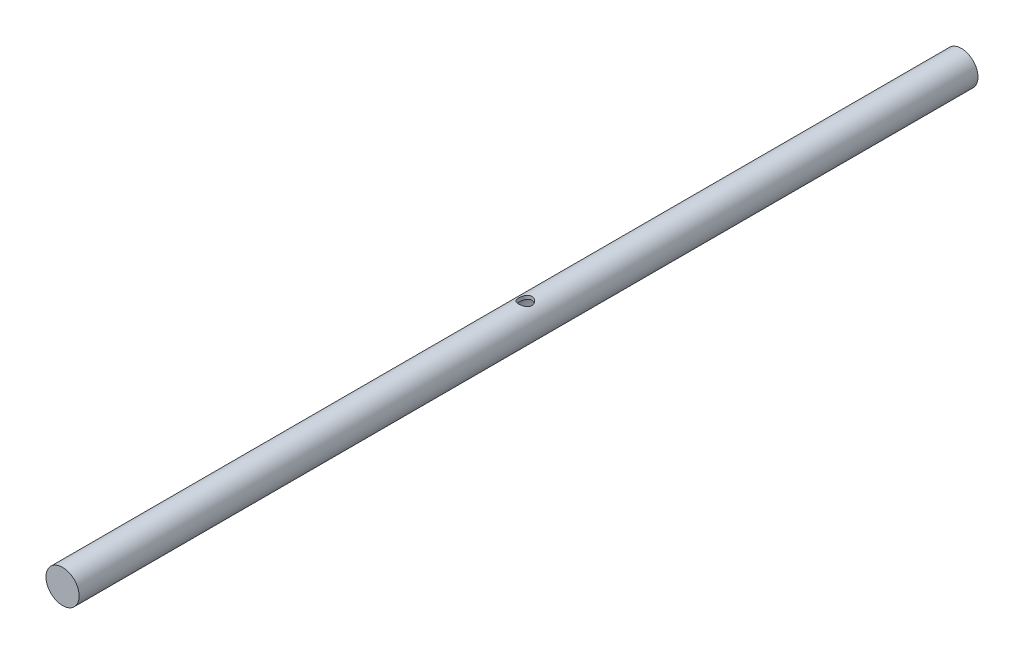
ISO-10303-21;
HEADER;
FILE_DESCRIPTION(('STEP AP214'),'2;1');
FILE_NAME('part.step','',(''),(''),'','','');
FILE_SCHEMA(('AUTOMOTIVE_DESIGN { 1 0 10303 214 1 1 1 1 }'));
ENDSEC;
DATA;
#1=APPLICATION_CONTEXT('core data for automotive mechanical design processes');
#2=APPLICATION_PROTOCOL_DEFINITION('international standard','automotive_design',2000,#1);
#3=PRODUCT_CONTEXT('',#1,'mechanical');
#4=PRODUCT('Part','Part','',(#3));
#5=PRODUCT_RELATED_PRODUCT_CATEGORY('part','',(#4));
#6=PRODUCT_DEFINITION_FORMATION('','',#4);
#7=PRODUCT_DEFINITION_CONTEXT('part definition',#1,'design');
#8=PRODUCT_DEFINITION('design','',#6,#7);
#9=PRODUCT_DEFINITION_SHAPE('','',#8);
#10=(LENGTH_UNIT() NAMED_UNIT(*) SI_UNIT(.MILLI.,.METRE.));
#11=(NAMED_UNIT(*) PLANE_ANGLE_UNIT() SI_UNIT($,.RADIAN.));
#12=(NAMED_UNIT(*) SI_UNIT($,.STERADIAN.) SOLID_ANGLE_UNIT());
#13=UNCERTAINTY_MEASURE_WITH_UNIT(LENGTH_MEASURE(1.E-05),#10,'distance_accuracy_value','');
#14=(GEOMETRIC_REPRESENTATION_CONTEXT(3) GLOBAL_UNCERTAINTY_ASSIGNED_CONTEXT((#13)) GLOBAL_UNIT_ASSIGNED_CONTEXT((#10,
#11,#12)) REPRESENTATION_CONTEXT('',''));
#15=CARTESIAN_POINT('',(0.,0.,0.));
#16=DIRECTION('',(0.,0.,1.));
#17=DIRECTION('',(1.,0.,0.));
#18=AXIS2_PLACEMENT_3D('',#15,#16,#17);
#19=CARTESIAN_POINT('',(0.,0.,172.085));
#20=DIRECTION('',(0.,0.,-1.));
#21=DIRECTION('',(-1.,0.,0.));
#22=AXIS2_PLACEMENT_3D('',#19,#20,#21);
#23=CYLINDRICAL_SURFACE('',#22,3.175);
#24=CARTESIAN_POINT('',(0.,0.,172.085));
#25=DIRECTION('',(0.,0.,1.));
#26=DIRECTION('',(1.,0.,0.));
#27=AXIS2_PLACEMENT_3D('',#24,#25,#26);
#28=CIRCLE('',#27,3.175);
#29=CARTESIAN_POINT('',(3.175,0.,172.085));
#30=VERTEX_POINT('',#29);
#31=EDGE_CURVE('E10',#30,#30,#28,.T.);
#32=ORIENTED_EDGE('',*,*,#31,.F.);
#33=EDGE_LOOP('',(#32));
#34=FACE_BOUND('',#33,.T.);
#35=CARTESIAN_POINT('',(0.,0.,0.));
#36=DIRECTION('',(0.,0.,1.));
#37=DIRECTION('',(1.,0.,0.));
#38=AXIS2_PLACEMENT_3D('',#35,#36,#37);
#39=CIRCLE('',#38,3.175);
#40=CARTESIAN_POINT('',(3.175,0.,0.));
#41=VERTEX_POINT('',#40);
#42=EDGE_CURVE('E43',#41,#41,#39,.T.);
#43=ORIENTED_EDGE('',*,*,#42,.T.);
#44=EDGE_LOOP('',(#43));
#45=FACE_BOUND('',#44,.T.);
#46=CARTESIAN_POINT('',(0.,3.175,82.2325));
#47=CARTESIAN_POINT('',(-0.068258058456236,3.17499537229199,82.2325062559081));
#48=CARTESIAN_POINT('',(-0.136634578197577,3.17277301884902,82.2380357725761));
#49=CARTESIAN_POINT('',(-0.271460265065364,3.16409992718907,82.259962291736));
#50=CARTESIAN_POINT('',(-0.337903678751393,3.15763769473787,82.2763888372197));
#51=CARTESIAN_POINT('',(-0.466695740931902,3.1411812285033,82.3194163095674));
#52=CARTESIAN_POINT('',(-0.529057020126769,3.13119856591186,82.3459839273476));
#53=CARTESIAN_POINT('',(-0.648380701158513,3.1086844785551,82.4084071750624));
#54=CARTESIAN_POINT('',(-0.705344967736879,3.09615393885866,82.4442595808735));
#55=CARTESIAN_POINT('',(-0.815023139807199,3.06915112718216,82.5260195415862));
#56=CARTESIAN_POINT('',(-0.867449543069387,3.05461858550036,82.5722927267126));
#57=CARTESIAN_POINT('',(-0.964041128038302,3.02552466335433,82.6728090022077));
#58=CARTESIAN_POINT('',(-1.0082022680298,3.01096327228158,82.7270559687294));
#59=CARTESIAN_POINT('',(-1.08894535023098,2.98273972791181,82.8449118246039));
#60=CARTESIAN_POINT('',(-1.12510251305913,2.96914643637744,82.9088299186247));
#61=CARTESIAN_POINT('',(-1.18602424658859,2.94534365963613,83.0424656129967));
#62=CARTESIAN_POINT('',(-1.21079422832151,2.93513256790051,83.1121804401837));
#63=CARTESIAN_POINT('',(-1.24707575285638,2.9198973711462,83.252127331831));
#64=CARTESIAN_POINT('',(-1.25913766828659,2.91465901925809,83.3221925345909));
#65=CARTESIAN_POINT('',(-1.27137983064142,2.90934142571206,83.4635332239251));
#66=CARTESIAN_POINT('',(-1.2715659203589,2.90925964706958,83.5348080980869));
#67=CARTESIAN_POINT('',(-1.26046824836539,2.91408167677796,83.6712554863759));
#68=CARTESIAN_POINT('',(-1.24998182458377,2.91863891149416,83.7365074786498));
#69=CARTESIAN_POINT('',(-1.21916626898912,2.93164379130976,83.8642338180643));
#70=CARTESIAN_POINT('',(-1.19883541970094,2.94009211524262,83.9267076784501));
#71=CARTESIAN_POINT('',(-1.14852115516993,2.96011273031217,84.0486113259845));
#72=CARTESIAN_POINT('',(-1.11834921257023,2.971745258433,84.1079529667997));
#73=CARTESIAN_POINT('',(-1.04934160256496,2.9968070390758,84.2209490433896));
#74=CARTESIAN_POINT('',(-1.01050268123904,3.01023696565099,84.2746013319708));
#75=CARTESIAN_POINT('',(-0.921734630653569,3.03864477831342,84.3790601777893));
#76=CARTESIAN_POINT('',(-0.87118028898635,3.05366207259856,84.4293261431982));
#77=CARTESIAN_POINT('',(-0.762199661418166,3.08266988848509,84.5208396435313));
#78=CARTESIAN_POINT('',(-0.703771811487362,3.09666020522781,84.5620853823556));
#79=CARTESIAN_POINT('',(-0.579169309404708,3.12238822602988,84.6350970791091));
#80=CARTESIAN_POINT('',(-0.51286441200501,3.13407596510588,84.6666596485601));
#81=CARTESIAN_POINT('',(-0.375300091081626,3.15350415988762,84.7179965917846));
#82=CARTESIAN_POINT('',(-0.304043204999539,3.16124662048613,84.737776953849));
#83=CARTESIAN_POINT('',(-0.163128888630963,3.17154648586888,84.7638946675915));
#84=CARTESIAN_POINT('',(-0.093626491680812,3.17438370604281,84.770958508451));
#85=CARTESIAN_POINT('',(0.0456217717279651,3.17543483854251,84.7735878188357));
#86=CARTESIAN_POINT('',(0.115367570397192,3.17364994924755,84.7691562687827));
#87=CARTESIAN_POINT('',(0.249829789342462,3.16584055085483,84.7494547371295));
#88=CARTESIAN_POINT('',(0.314631382277427,3.16001013504407,84.7346806824771));
#89=CARTESIAN_POINT('',(0.440775996818596,3.14489745292492,84.6953883252233));
#90=CARTESIAN_POINT('',(0.502118572992776,3.13561474321397,84.6708687709104));
#91=CARTESIAN_POINT('',(0.621715028993605,3.11414537679465,84.6119815633032));
#92=CARTESIAN_POINT('',(0.679817044449683,3.10187858147175,84.5773356252526));
#93=CARTESIAN_POINT('',(0.789586680441565,3.07577086613408,84.4994878943199));
#94=CARTESIAN_POINT('',(0.841251708883318,3.06192931625022,84.4562826727442));
#95=CARTESIAN_POINT('',(0.940259132323303,3.03304649700201,84.359197541777));
#96=CARTESIAN_POINT('',(0.987090947966854,3.01798635304908,84.3048012011436));
#97=CARTESIAN_POINT('',(1.07108701035771,2.98920962302379,84.1886555472891));
#98=CARTESIAN_POINT('',(1.10824966394932,2.97549325859334,84.1269050247842));
#99=CARTESIAN_POINT('',(1.17208776372659,2.95093580441395,83.9968718239328));
#100=CARTESIAN_POINT('',(1.19865812752938,2.9401238561184,83.9285316605002));
#101=CARTESIAN_POINT('',(1.23970809951287,2.92305532658486,83.7877841311609));
#102=CARTESIAN_POINT('',(1.25419663134602,2.91679538366959,83.7153798093091));
#103=CARTESIAN_POINT('',(1.26981941697179,2.91002567155453,83.5741737823732));
#104=CARTESIAN_POINT('',(1.27183964726232,2.90913452340189,83.5054877768582));
#105=CARTESIAN_POINT('',(1.26479500614123,2.91220420881017,83.3688040153521));
#106=CARTESIAN_POINT('',(1.25573154232526,2.91616442626244,83.3008061730719));
#107=CARTESIAN_POINT('',(1.22750031750757,2.92815422165178,83.1701840594421));
#108=CARTESIAN_POINT('',(1.20874630841757,2.9360166821043,83.107453625735));
#109=CARTESIAN_POINT('',(1.16205345979179,2.95480740782762,82.9860045701954));
#110=CARTESIAN_POINT('',(1.13411208368507,2.96573651965814,82.9272870617186));
#111=CARTESIAN_POINT('',(1.06798920435243,2.99020617098852,82.811867891763));
#112=CARTESIAN_POINT('',(1.02931298782628,3.00386040268909,82.7554741444671));
#113=CARTESIAN_POINT('',(0.943541495737399,3.03189515776371,82.6496992435756));
#114=CARTESIAN_POINT('',(0.896443682609507,3.04627589910738,82.6003202116985));
#115=CARTESIAN_POINT('',(0.791530996483016,3.07526415100495,82.5066911881776));
#116=CARTESIAN_POINT('',(0.733219260727802,3.08982591305988,82.4629813101197));
#117=CARTESIAN_POINT('',(0.609536703381478,3.1165825826321,82.3859559779353));
#118=CARTESIAN_POINT('',(0.544162617887505,3.12877638843995,82.3526453577832));
#119=CARTESIAN_POINT('',(0.409408669684464,3.14921718908072,82.2981448933542));
#120=CARTESIAN_POINT('',(0.340126077569516,3.15753345539943,82.2767408795392));
#121=CARTESIAN_POINT('',(0.198676606888582,3.16956634442947,82.246064158194));
#122=CARTESIAN_POINT('',(0.126519638920414,3.1732975617973,82.2367529526676));
#123=CARTESIAN_POINT('',(0.0361393091607427,3.17484696185127,82.2328839330788));
#124=CARTESIAN_POINT('',(0.0180738073503828,3.17500122535427,82.2324983435205));
#125=CARTESIAN_POINT('',(0.,3.175,82.2325));
#126=B_SPLINE_CURVE_WITH_KNOTS('',3,(#46,#47,#48,#49,#50,#51,#52,#53,#54,#55,#56,#57,#58,#59,
#60,#61,#62,#63,#64,#65,#66,#67,#68,#69,#70,#71,#72,#73,#74,#75,#76,#77,#78,#79,#80,#81,#82,#83,
#84,#85,#86,#87,#88,#89,#90,#91,#92,#93,#94,#95,#96,#97,#98,#99,#100,#101,#102,#103,#104,#105,
#106,#107,#108,#109,#110,#111,#112,#113,#114,#115,#116,#117,#118,#119,#120,#121,#122,#123,#124,
#125),.UNSPECIFIED.,.T.,.F.,(4,2,2,2,2,2,2,2,2,2,2,2,2,2,2,2,2,2,2,2,2,2,2,2,2,2,2,2,2,2,2,2,2,
2,2,2,2,2,2,4),(0.,0.204725897312101,0.410009108865039,0.61462377549445,0.819167485156698,
1.03249337379752,1.24592330783352,1.46885189350204,1.69167443680101,1.90439106871108,
2.11700304526211,2.31481838534874,2.51266824907591,2.71455595199749,2.91651957930747,
3.13409551733465,3.35171473953232,3.57363339858384,3.79543917132259,4.00411432175286,
4.21273537417004,4.41198289283374,4.61125601111062,4.81662431007898,5.02207504281847,
5.24108981386504,5.46014064842782,5.68131353664428,5.9023229213017,6.10742792604398,
6.31250688577536,6.50947592278472,6.70649938736281,6.91480372216003,7.12317092856233,
7.34504768943988,7.5670274341174,7.7848733114346,8.0020239527676,8.05623259144468),.UNSPECIFIED.);
#127=CARTESIAN_POINT('',(0.,3.175,82.2325));
#128=VERTEX_POINT('',#127);
#129=EDGE_CURVE('E53',#128,#128,#126,.T.);
#130=ORIENTED_EDGE('',*,*,#129,.F.);
#131=EDGE_LOOP('',(#130));
#132=FACE_BOUND('',#131,.T.);
#133=ADVANCED_FACE('F31',(#34,#45,#132),#23,.T.);
#134=CARTESIAN_POINT('',(0.,0.,172.085));
#135=DIRECTION('',(0.,0.,-1.));
#136=DIRECTION('',(-1.,0.,0.));
#137=AXIS2_PLACEMENT_3D('',#134,#135,#136);
#138=CYLINDRICAL_SURFACE('',#137,2.54);
#139=CARTESIAN_POINT('',(0.,0.,0.));
#140=DIRECTION('',(0.,0.,1.));
#141=DIRECTION('',(1.,0.,0.));
#142=AXIS2_PLACEMENT_3D('',#139,#140,#141);
#143=CIRCLE('',#142,2.54);
#144=CARTESIAN_POINT('',(2.54,0.,0.));
#145=VERTEX_POINT('',#144);
#146=EDGE_CURVE('E50',#145,#145,#143,.T.);
#147=ORIENTED_EDGE('',*,*,#146,.F.);
#148=EDGE_LOOP('',(#147));
#149=FACE_BOUND('',#148,.T.);
#150=CARTESIAN_POINT('',(0.,0.,171.45));
#151=DIRECTION('',(0.,0.,1.));
#152=DIRECTION('',(1.,0.,0.));
#153=AXIS2_PLACEMENT_3D('',#150,#151,#152);
#154=CIRCLE('',#153,2.54);
#155=CARTESIAN_POINT('',(2.54,0.,171.45));
#156=VERTEX_POINT('',#155);
#157=EDGE_CURVE('E48',#156,#156,#154,.T.);
#158=ORIENTED_EDGE('',*,*,#157,.T.);
#159=EDGE_LOOP('',(#158));
#160=FACE_BOUND('',#159,.T.);
#161=CARTESIAN_POINT('',(0.,2.54,82.2325));
#162=CARTESIAN_POINT('',(-0.0667663929502925,2.53999636023272,82.2325041939458));
#163=CARTESIAN_POINT('',(-0.1336123816165,2.53733923594787,82.2377959928645));
#164=CARTESIAN_POINT('',(-0.265328698790899,2.52697178167493,82.258729158033));
#165=CARTESIAN_POINT('',(-0.33019503012615,2.51925185542809,82.274390179107));
#166=CARTESIAN_POINT('',(-0.455845601998328,2.49956674842206,82.3152961369433));
#167=CARTESIAN_POINT('',(-0.516644639732754,2.48761807755451,82.340503827995));
#168=CARTESIAN_POINT('',(-0.633060223344333,2.46057136175039,82.3995946891335));
#169=CARTESIAN_POINT('',(-0.68867717736736,2.44547356514583,82.433477175196));
#170=CARTESIAN_POINT('',(-0.796934928557637,2.41244447987732,82.5112869068463));
#171=CARTESIAN_POINT('',(-0.849192118125082,2.39439702891971,82.5556978286344));
#172=CARTESIAN_POINT('',(-0.945869894981064,2.35788162213365,82.6522622786437));
#173=CARTESIAN_POINT('',(-0.990284510545599,2.33941335785474,82.704421651751));
#174=CARTESIAN_POINT('',(-1.07347004057186,2.30249668020631,82.8198538538947));
#175=CARTESIAN_POINT('',(-1.11153617615058,2.28416087452067,82.8836748448993));
#176=CARTESIAN_POINT('',(-1.17623364815119,2.25153193040847,83.0178265167025));
#177=CARTESIAN_POINT('',(-1.20287315300725,2.23723590660877,83.0881525034779));
#178=CARTESIAN_POINT('',(-1.24222820157951,2.21561491138017,83.2290246838859));
#179=CARTESIAN_POINT('',(-1.25568183849217,2.20792384911316,83.2993056541256));
#180=CARTESIAN_POINT('',(-1.27054228150224,2.1994100023463,83.4415131239799));
#181=CARTESIAN_POINT('',(-1.27196099223381,2.19858043065976,83.5134379269064));
#182=CARTESIAN_POINT('',(-1.26325285470882,2.20358881426705,83.6476432508805));
#183=CARTESIAN_POINT('',(-1.25448639061177,2.20864129850757,83.7100485196533));
#184=CARTESIAN_POINT('',(-1.22801360830231,2.22346810491989,83.8323468249038));
#185=CARTESIAN_POINT('',(-1.21030444235003,2.23324393116355,83.8922390545377));
#186=CARTESIAN_POINT('',(-1.16612642109023,2.25663095044181,84.0095209983584));
#187=CARTESIAN_POINT('',(-1.13946313523732,2.27032617643278,84.066819926458));
#188=CARTESIAN_POINT('',(-1.07828294333837,2.30001323437382,84.1764055515893));
#189=CARTESIAN_POINT('',(-1.04376250964184,2.31600609670842,84.2286899822121));
#190=CARTESIAN_POINT('',(-0.962743889739248,2.35093710537173,84.3337419909839));
#191=CARTESIAN_POINT('',(-0.915281962129001,2.36999158000667,84.3857302294417));
#192=CARTESIAN_POINT('',(-0.812235585001559,2.40725481591517,84.4813339816104));
#193=CARTESIAN_POINT('',(-0.75664727584935,2.42546316987677,84.524945493883));
#194=CARTESIAN_POINT('',(-0.635655962406451,2.46001523849364,84.6044607895078));
#195=CARTESIAN_POINT('',(-0.569917061331257,2.47623309885749,84.6399126000061));
#196=CARTESIAN_POINT('',(-0.432392093670782,2.50390509023977,84.6989632268846));
#197=CARTESIAN_POINT('',(-0.36061088185691,2.51536300258312,84.7225714549693));
#198=CARTESIAN_POINT('',(-0.219413444409098,2.53141903851624,84.7553237627202));
#199=CARTESIAN_POINT('',(-0.150293743796378,2.53650671642666,84.7655038693984));
#200=CARTESIAN_POINT('',(-0.0111500919356839,2.54092727093059,84.7743602085408));
#201=CARTESIAN_POINT('',(0.0588734152347709,2.54026287376067,84.7730418907622));
#202=CARTESIAN_POINT('',(0.192065874422208,2.5335381416187,84.7595375057082));
#203=CARTESIAN_POINT('',(0.255345448223436,2.52790002024001,84.7482016834329));
#204=CARTESIAN_POINT('',(0.378976753223429,2.5123415756982,84.7163176486932));
#205=CARTESIAN_POINT('',(0.439328160827562,2.50242078044602,84.6957684206043));
#206=CARTESIAN_POINT('',(0.557388532731071,2.4788399929536,84.6455019476299));
#207=CARTESIAN_POINT('',(0.61497260419781,2.46508119847823,84.6155393663517));
#208=CARTESIAN_POINT('',(0.724485929357626,2.43514847382729,84.5475734297295));
#209=CARTESIAN_POINT('',(0.776412759814607,2.41897351568547,84.5095666490664));
#210=CARTESIAN_POINT('',(0.87854496539913,2.3838944109858,84.4222842598273));
#211=CARTESIAN_POINT('',(0.92808053883729,2.36487823757521,84.372268557064));
#212=CARTESIAN_POINT('',(1.01835752781381,2.32743237336921,84.264595057888));
#213=CARTESIAN_POINT('',(1.05909285982737,2.30900309574539,84.2069320191032));
#214=CARTESIAN_POINT('',(1.13246905141207,2.27395014127107,84.0820725591656));
#215=CARTESIAN_POINT('',(1.16462237976587,2.25745712672609,84.0145496919151));
#216=CARTESIAN_POINT('',(1.21676518903753,2.2297907190752,83.8739622140305));
#217=CARTESIAN_POINT('',(1.23677034317722,2.21861047565585,83.8009048813435));
#218=CARTESIAN_POINT('',(1.2622043430611,2.20423106281007,83.658824016966));
#219=CARTESIAN_POINT('',(1.2688481054291,2.20036876994824,83.5900864981451));
#220=CARTESIAN_POINT('',(1.2708752260636,2.19920000400642,83.4524022246932));
#221=CARTESIAN_POINT('',(1.26626346521299,2.20189068926992,83.3834555737009));
#222=CARTESIAN_POINT('',(1.24704617950218,2.21282084803531,83.2542359530543));
#223=CARTESIAN_POINT('',(1.23343455921536,2.2205072999264,83.1937624029166));
#224=CARTESIAN_POINT('',(1.19783270494531,2.23991190558655,83.0760236883306));
#225=CARTESIAN_POINT('',(1.17583977577296,2.25163135613488,83.0187595627432));
#226=CARTESIAN_POINT('',(1.12244599653187,2.2787423356295,82.904806439247));
#227=CARTESIAN_POINT('',(1.09051234502691,2.29432767443162,82.8484145646763));
#228=CARTESIAN_POINT('',(1.01873173397854,2.32708871175929,82.7414213390507));
#229=CARTESIAN_POINT('',(0.978880657473093,2.34426523519043,82.6908230222415));
#230=CARTESIAN_POINT('',(0.886718224864103,2.38077150412327,82.5904596824059));
#231=CARTESIAN_POINT('',(0.833481217222927,2.40010928805565,82.5415429400004));
#232=CARTESIAN_POINT('',(0.719016603899765,2.43684745363961,82.453146011052));
#233=CARTESIAN_POINT('',(0.657784718536125,2.45424678832211,82.4136709109286));
#234=CARTESIAN_POINT('',(0.528233127961338,2.48536472173081,82.345229819292));
#235=CARTESIAN_POINT('',(0.459866369996967,2.49905642634894,82.3163401048475));
#236=CARTESIAN_POINT('',(0.318442468643631,2.52096703531601,82.2708436267429));
#237=CARTESIAN_POINT('',(0.245399305521431,2.52920148683624,82.2542019545264));
#238=CARTESIAN_POINT('',(0.143004472033908,2.53613236625272,82.2402502879337));
#239=CARTESIAN_POINT('',(0.114505586888172,2.53757893980786,82.2373480461032));
#240=CARTESIAN_POINT('',(0.0573426993950949,2.53951355161888,82.2334719747936));
#241=CARTESIAN_POINT('',(0.0286786925121767,2.54000156341779,82.2324981985416));
#242=CARTESIAN_POINT('',(0.,2.54,82.2325));
#243=B_SPLINE_CURVE_WITH_KNOTS('',3,(#161,#162,#163,#164,#165,#166,#167,#168,#169,#170,#171,
#172,#173,#174,#175,#176,#177,#178,#179,#180,#181,#182,#183,#184,#185,#186,#187,#188,#189,#190,
#191,#192,#193,#194,#195,#196,#197,#198,#199,#200,#201,#202,#203,#204,#205,#206,#207,#208,#209,
#210,#211,#212,#213,#214,#215,#216,#217,#218,#219,#220,#221,#222,#223,#224,#225,#226,#227,#228,
#229,#230,#231,#232,#233,#234,#235,#236,#237,#238,#239,#240,#241,#242),.UNSPECIFIED.,.T.,.F.,(4,
2,2,2,2,2,2,2,2,2,2,2,2,2,2,2,2,2,2,2,2,2,2,2,2,2,2,2,2,2,2,2,2,2,2,2,2,2,2,2,4),(0.,
0.20018280692377,0.400746150130682,0.60053493747521,0.800307975938585,1.01216683357198,
1.22418632182064,1.45264792567057,1.68094593830819,1.89557675418092,2.10999523807855,
2.29877254759836,2.4876100098561,2.6808460501398,2.87416902000482,3.09200475494025,
3.30994428940332,3.5380043821234,3.76588295478596,3.9748877889861,4.18379356929576,
4.37650771262776,4.56924310471284,4.76748927155432,4.96582002450392,5.18362705518413,
5.401584175416,5.63009646342787,5.85831330164789,6.06462220522937,6.27084166022208,
6.45741571410114,6.64404981555273,6.84322300105032,7.04250002646478,7.26599058295675,
7.4896012688825,7.71479297351917,7.93934033953663,8.02532405774878,8.11131014913859),.UNSPECIFIED.);
#244=CARTESIAN_POINT('',(0.,2.54,82.2325));
#245=VERTEX_POINT('',#244);
#246=EDGE_CURVE('E35',#245,#245,#243,.T.);
#247=ORIENTED_EDGE('',*,*,#246,.T.);
#248=EDGE_LOOP('',(#247));
#249=FACE_BOUND('',#248,.T.);
#250=ADVANCED_FACE('F64',(#149,#160,#249),#138,.F.);
#251=CARTESIAN_POINT('',(0.,0.,172.085));
#252=DIRECTION('',(0.,0.,1.));
#253=DIRECTION('',(1.,0.,0.));
#254=AXIS2_PLACEMENT_3D('',#251,#252,#253);
#255=PLANE('',#254);
#256=ORIENTED_EDGE('',*,*,#31,.T.);
#257=EDGE_LOOP('',(#256));
#258=FACE_BOUND('',#257,.T.);
#259=ADVANCED_FACE('F69',(#258),#255,.T.);
#260=CARTESIAN_POINT('',(0.,0.,0.));
#261=DIRECTION('',(0.,0.,1.));
#262=DIRECTION('',(1.,0.,0.));
#263=AXIS2_PLACEMENT_3D('',#260,#261,#262);
#264=PLANE('',#263);
#265=ORIENTED_EDGE('',*,*,#146,.T.);
#266=EDGE_LOOP('',(#265));
#267=FACE_BOUND('',#266,.T.);
#268=ORIENTED_EDGE('',*,*,#42,.F.);
#269=EDGE_LOOP('',(#268));
#270=FACE_BOUND('',#269,.T.);
#271=ADVANCED_FACE('F73',(#267,#270),#264,.F.);
#272=CARTESIAN_POINT('',(0.,0.,171.45));
#273=DIRECTION('',(0.,0.,1.));
#274=DIRECTION('',(1.,0.,0.));
#275=AXIS2_PLACEMENT_3D('',#272,#273,#274);
#276=PLANE('',#275);
#277=ORIENTED_EDGE('',*,*,#157,.F.);
#278=EDGE_LOOP('',(#277));
#279=FACE_BOUND('',#278,.T.);
#280=ADVANCED_FACE('F62',(#279),#276,.F.);
#281=CARTESIAN_POINT('',(0.,5.08,83.5025));
#282=DIRECTION('',(0.,-1.,0.));
#283=DIRECTION('',(0.,0.,-1.));
#284=AXIS2_PLACEMENT_3D('',#281,#282,#283);
#285=CYLINDRICAL_SURFACE('',#284,1.27);
#286=ORIENTED_EDGE('',*,*,#246,.F.);
#287=EDGE_LOOP('',(#286));
#288=FACE_BOUND('',#287,.T.);
#289=ORIENTED_EDGE('',*,*,#129,.T.);
#290=EDGE_LOOP('',(#289));
#291=FACE_BOUND('',#290,.T.);
#292=ADVANCED_FACE('F59',(#288,#291),#285,.F.);
#293=CLOSED_SHELL('',(#133,#250,#259,#271,#280,#292));
#294=MANIFOLD_SOLID_BREP('B2',#293);
#295=ADVANCED_BREP_SHAPE_REPRESENTATION('',(#18,#294),#14);
#296=SHAPE_DEFINITION_REPRESENTATION(#9,#295);
ENDSEC;
END-ISO-10303-21;
